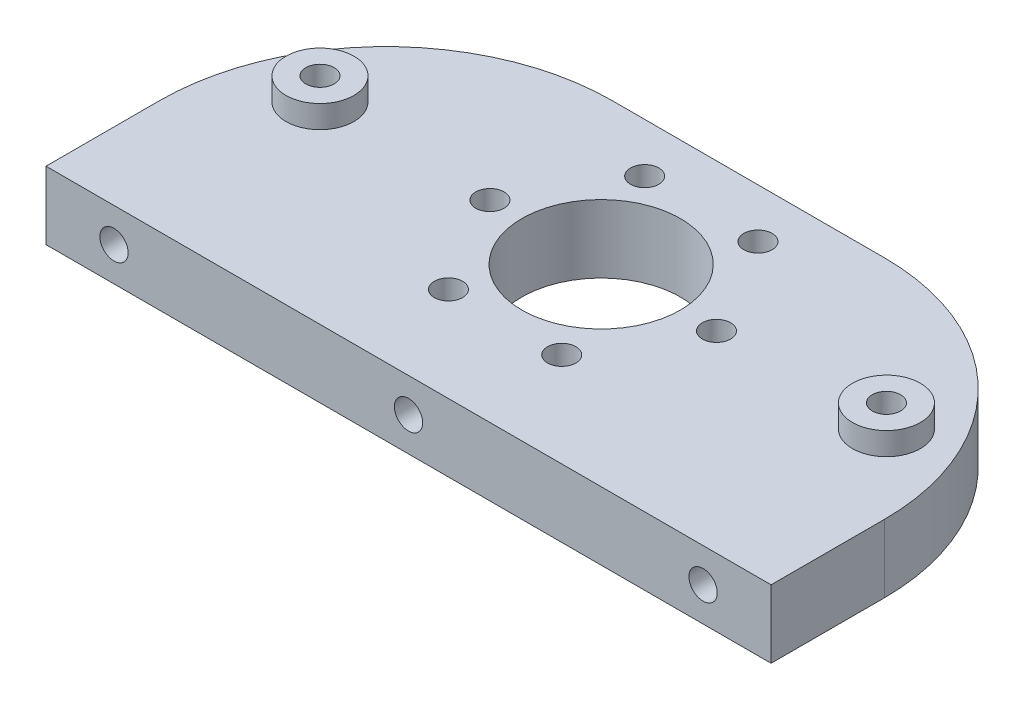
ISO-10303-21;
HEADER;
FILE_DESCRIPTION(('STEP AP214'),'2;1');
FILE_NAME('part.step','',(''),(''),'','','');
FILE_SCHEMA(('AUTOMOTIVE_DESIGN { 1 0 10303 214 1 1 1 1 }'));
ENDSEC;
DATA;
#1=APPLICATION_CONTEXT('core data for automotive mechanical design processes');
#2=APPLICATION_PROTOCOL_DEFINITION('international standard','automotive_design',2000,#1);
#3=PRODUCT_CONTEXT('',#1,'mechanical');
#4=PRODUCT('Part','Part','',(#3));
#5=PRODUCT_RELATED_PRODUCT_CATEGORY('part','',(#4));
#6=PRODUCT_DEFINITION_FORMATION('','',#4);
#7=PRODUCT_DEFINITION_CONTEXT('part definition',#1,'design');
#8=PRODUCT_DEFINITION('design','',#6,#7);
#9=PRODUCT_DEFINITION_SHAPE('','',#8);
#10=(LENGTH_UNIT() NAMED_UNIT(*) SI_UNIT(.MILLI.,.METRE.));
#11=(NAMED_UNIT(*) PLANE_ANGLE_UNIT() SI_UNIT($,.RADIAN.));
#12=(NAMED_UNIT(*) SI_UNIT($,.STERADIAN.) SOLID_ANGLE_UNIT());
#13=UNCERTAINTY_MEASURE_WITH_UNIT(LENGTH_MEASURE(1.E-05),#10,'distance_accuracy_value','');
#14=(GEOMETRIC_REPRESENTATION_CONTEXT(3) GLOBAL_UNCERTAINTY_ASSIGNED_CONTEXT((#13)) GLOBAL_UNIT_ASSIGNED_CONTEXT((#10,
#11,#12)) REPRESENTATION_CONTEXT('',''));
#15=CARTESIAN_POINT('',(0.,0.,0.));
#16=DIRECTION('',(0.,0.,1.));
#17=DIRECTION('',(1.,0.,0.));
#18=AXIS2_PLACEMENT_3D('',#15,#16,#17);
#19=CARTESIAN_POINT('',(-53.365810967445,3.,7.67533084864312));
#20=DIRECTION('',(1.,0.,0.));
#21=DIRECTION('',(0.,0.,-1.));
#22=AXIS2_PLACEMENT_3D('',#19,#20,#21);
#23=PLANE('',#22);
#24=DIRECTION('',(0.,0.,1.));
#25=VECTOR('',#24,1.);
#26=CARTESIAN_POINT('',(-53.365810967445,3.,7.67533084864312));
#27=LINE('',#26,#25);
#28=CARTESIAN_POINT('',(-53.365810967445,3.,17.6753308486431));
#29=VERTEX_POINT('',#28);
#30=CARTESIAN_POINT('',(-53.365810967445,3.,22.6753308486431));
#31=VERTEX_POINT('',#30);
#32=EDGE_CURVE('E239',#29,#31,#27,.T.);
#33=ORIENTED_EDGE('',*,*,#32,.F.);
#34=DIRECTION('',(0.,-1.,0.));
#35=VECTOR('',#34,1.);
#36=CARTESIAN_POINT('',(-53.365810967445,3.,17.6753308486431));
#37=LINE('',#36,#35);
#38=CARTESIAN_POINT('',(-53.365810967445,0.,17.6753308486431));
#39=VERTEX_POINT('',#38);
#40=EDGE_CURVE('E11',#29,#39,#37,.T.);
#41=ORIENTED_EDGE('',*,*,#40,.T.);
#42=DIRECTION('',(0.,0.,1.));
#43=VECTOR('',#42,1.);
#44=CARTESIAN_POINT('',(-53.365810967445,0.,7.67533084864312));
#45=LINE('',#44,#43);
#46=CARTESIAN_POINT('',(-53.365810967445,0.,22.6753308486431));
#47=VERTEX_POINT('',#46);
#48=EDGE_CURVE('E253',#39,#47,#45,.T.);
#49=ORIENTED_EDGE('',*,*,#48,.T.);
#50=DIRECTION('',(0.,-1.,0.));
#51=VECTOR('',#50,1.);
#52=CARTESIAN_POINT('',(-53.365810967445,3.,22.6753308486431));
#53=LINE('',#52,#51);
#54=EDGE_CURVE('E268',#31,#47,#53,.T.);
#55=ORIENTED_EDGE('',*,*,#54,.F.);
#56=EDGE_LOOP('',(#33,#41,#49,#55));
#57=FACE_BOUND('',#56,.T.);
#58=ADVANCED_FACE('F55',(#57),#23,.F.);
#59=CARTESIAN_POINT('',(-53.365810967445,3.,22.6753308486431));
#60=DIRECTION('',(0.,0.,-1.));
#61=DIRECTION('',(-1.,0.,0.));
#62=AXIS2_PLACEMENT_3D('',#59,#60,#61);
#63=PLANE('',#62);
#64=CARTESIAN_POINT('',(-50.365810967445,1.5,22.6753308486431));
#65=DIRECTION('',(0.,0.,1.));
#66=DIRECTION('',(1.,0.,0.));
#67=AXIS2_PLACEMENT_3D('',#64,#65,#66);
#68=CIRCLE('',#67,0.624999999999987);
#69=CARTESIAN_POINT('',(-49.740810967445,1.5,22.6753308486431));
#70=VERTEX_POINT('',#69);
#71=EDGE_CURVE('E131',#70,#70,#68,.T.);
#72=ORIENTED_EDGE('',*,*,#71,.F.);
#73=EDGE_LOOP('',(#72));
#74=FACE_BOUND('',#73,.T.);
#75=CARTESIAN_POINT('',(-24.365810967445,1.5,22.6753308486431));
#76=DIRECTION('',(0.,0.,1.));
#77=DIRECTION('',(1.,0.,0.));
#78=AXIS2_PLACEMENT_3D('',#75,#76,#77);
#79=CIRCLE('',#78,0.62499999999999);
#80=CARTESIAN_POINT('',(-23.740810967445,1.5,22.6753308486431));
#81=VERTEX_POINT('',#80);
#82=EDGE_CURVE('E130',#81,#81,#79,.T.);
#83=ORIENTED_EDGE('',*,*,#82,.F.);
#84=EDGE_LOOP('',(#83));
#85=FACE_BOUND('',#84,.T.);
#86=CARTESIAN_POINT('',(-37.365810967445,1.5,22.6753308486431));
#87=DIRECTION('',(0.,0.,1.));
#88=DIRECTION('',(1.,0.,0.));
#89=AXIS2_PLACEMENT_3D('',#86,#87,#88);
#90=CIRCLE('',#89,0.624999999999987);
#91=CARTESIAN_POINT('',(-36.740810967445,1.5,22.6753308486431));
#92=VERTEX_POINT('',#91);
#93=EDGE_CURVE('E146',#92,#92,#90,.T.);
#94=ORIENTED_EDGE('',*,*,#93,.F.);
#95=EDGE_LOOP('',(#94));
#96=FACE_BOUND('',#95,.T.);
#97=DIRECTION('',(1.,0.,0.));
#98=VECTOR('',#97,1.);
#99=CARTESIAN_POINT('',(-53.365810967445,0.,22.6753308486431));
#100=LINE('',#99,#98);
#101=CARTESIAN_POINT('',(-21.365810967445,0.,22.6753308486431));
#102=VERTEX_POINT('',#101);
#103=EDGE_CURVE('E256',#47,#102,#100,.T.);
#104=ORIENTED_EDGE('',*,*,#103,.T.);
#105=DIRECTION('',(0.,-1.,0.));
#106=VECTOR('',#105,1.);
#107=CARTESIAN_POINT('',(-21.365810967445,3.,22.6753308486431));
#108=LINE('',#107,#106);
#109=CARTESIAN_POINT('',(-21.365810967445,3.,22.6753308486431));
#110=VERTEX_POINT('',#109);
#111=EDGE_CURVE('E252',#110,#102,#108,.T.);
#112=ORIENTED_EDGE('',*,*,#111,.F.);
#113=DIRECTION('',(1.,0.,0.));
#114=VECTOR('',#113,1.);
#115=CARTESIAN_POINT('',(-53.365810967445,3.,22.6753308486431));
#116=LINE('',#115,#114);
#117=EDGE_CURVE('E242',#31,#110,#116,.T.);
#118=ORIENTED_EDGE('',*,*,#117,.F.);
#119=ORIENTED_EDGE('',*,*,#54,.T.);
#120=EDGE_LOOP('',(#104,#112,#118,#119));
#121=FACE_BOUND('',#120,.T.);
#122=ADVANCED_FACE('F312',(#74,#85,#96,#121),#63,.F.);
#123=CARTESIAN_POINT('',(-21.365810967445,3.,7.67533084864312));
#124=DIRECTION('',(-1.,0.,0.));
#125=DIRECTION('',(0.,0.,1.));
#126=AXIS2_PLACEMENT_3D('',#123,#124,#125);
#127=PLANE('',#126);
#128=DIRECTION('',(0.,0.,-1.));
#129=VECTOR('',#128,1.);
#130=CARTESIAN_POINT('',(-21.365810967445,0.,7.67533084864312));
#131=LINE('',#130,#129);
#132=CARTESIAN_POINT('',(-21.365810967445,0.,17.6753308486431));
#133=VERTEX_POINT('',#132);
#134=EDGE_CURVE('E259',#102,#133,#131,.T.);
#135=ORIENTED_EDGE('',*,*,#134,.T.);
#136=DIRECTION('',(0.,-1.,0.));
#137=VECTOR('',#136,1.);
#138=CARTESIAN_POINT('',(-21.365810967445,3.,17.6753308486431));
#139=LINE('',#138,#137);
#140=CARTESIAN_POINT('',(-21.365810967445,3.,17.6753308486431));
#141=VERTEX_POINT('',#140);
#142=EDGE_CURVE('E79',#133,#141,#139,.F.);
#143=ORIENTED_EDGE('',*,*,#142,.T.);
#144=DIRECTION('',(0.,0.,-1.));
#145=VECTOR('',#144,1.);
#146=CARTESIAN_POINT('',(-21.365810967445,3.,7.67533084864312));
#147=LINE('',#146,#145);
#148=EDGE_CURVE('E246',#110,#141,#147,.T.);
#149=ORIENTED_EDGE('',*,*,#148,.F.);
#150=ORIENTED_EDGE('',*,*,#111,.T.);
#151=EDGE_LOOP('',(#135,#143,#149,#150));
#152=FACE_BOUND('',#151,.T.);
#153=ADVANCED_FACE('F308',(#152),#127,.F.);
#154=CARTESIAN_POINT('',(-53.365810967445,3.,7.67533084864312));
#155=DIRECTION('',(0.,0.,1.));
#156=DIRECTION('',(1.,0.,0.));
#157=AXIS2_PLACEMENT_3D('',#154,#155,#156);
#158=PLANE('',#157);
#159=DIRECTION('',(-1.,0.,0.));
#160=VECTOR('',#159,1.);
#161=CARTESIAN_POINT('',(-53.365810967445,3.,7.67533084864312));
#162=LINE('',#161,#160);
#163=CARTESIAN_POINT('',(-31.365810967445,3.,7.67533084864312));
#164=VERTEX_POINT('',#163);
#165=CARTESIAN_POINT('',(-43.365810967445,3.,7.67533084864312));
#166=VERTEX_POINT('',#165);
#167=EDGE_CURVE('E249',#164,#166,#162,.T.);
#168=ORIENTED_EDGE('',*,*,#167,.F.);
#169=DIRECTION('',(0.,-1.,0.));
#170=VECTOR('',#169,1.);
#171=CARTESIAN_POINT('',(-31.365810967445,3.,7.67533084864312));
#172=LINE('',#171,#170);
#173=CARTESIAN_POINT('',(-31.365810967445,0.,7.67533084864312));
#174=VERTEX_POINT('',#173);
#175=EDGE_CURVE('E278',#164,#174,#172,.T.);
#176=ORIENTED_EDGE('',*,*,#175,.T.);
#177=DIRECTION('',(-1.,0.,0.));
#178=VECTOR('',#177,1.);
#179=CARTESIAN_POINT('',(-53.365810967445,0.,7.67533084864312));
#180=LINE('',#179,#178);
#181=CARTESIAN_POINT('',(-43.365810967445,0.,7.67533084864312));
#182=VERTEX_POINT('',#181);
#183=EDGE_CURVE('E243',#174,#182,#180,.T.);
#184=ORIENTED_EDGE('',*,*,#183,.T.);
#185=DIRECTION('',(0.,-1.,0.));
#186=VECTOR('',#185,1.);
#187=CARTESIAN_POINT('',(-43.365810967445,3.,7.67533084864312));
#188=LINE('',#187,#186);
#189=EDGE_CURVE('E272',#182,#166,#188,.F.);
#190=ORIENTED_EDGE('',*,*,#189,.T.);
#191=EDGE_LOOP('',(#168,#176,#184,#190));
#192=FACE_BOUND('',#191,.T.);
#193=ADVANCED_FACE('F300',(#192),#158,.F.);
#194=CARTESIAN_POINT('',(0.,3.,0.));
#195=DIRECTION('',(0.,1.,0.));
#196=DIRECTION('',(0.,0.,1.));
#197=AXIS2_PLACEMENT_3D('',#194,#195,#196);
#198=PLANE('',#197);
#199=CARTESIAN_POINT('',(-49.7744643105847,3.,14.1753308486431));
#200=DIRECTION('',(0.,1.,0.));
#201=DIRECTION('',(0.,0.,1.));
#202=AXIS2_PLACEMENT_3D('',#199,#200,#201);
#203=CIRCLE('',#202,1.5);
#204=CARTESIAN_POINT('',(-49.7744643105847,3.,15.6753308486431));
#205=VERTEX_POINT('',#204);
#206=EDGE_CURVE('E176',#205,#205,#203,.T.);
#207=ORIENTED_EDGE('',*,*,#206,.F.);
#208=EDGE_LOOP('',(#207));
#209=FACE_BOUND('',#208,.T.);
#210=CARTESIAN_POINT('',(-24.7744643105847,3.,14.1753308486431));
#211=DIRECTION('',(0.,1.,0.));
#212=DIRECTION('',(0.,0.,1.));
#213=AXIS2_PLACEMENT_3D('',#210,#211,#212);
#214=CIRCLE('',#213,1.5);
#215=CARTESIAN_POINT('',(-24.7744643105847,3.,15.6753308486431));
#216=VERTEX_POINT('',#215);
#217=EDGE_CURVE('E180',#216,#216,#214,.T.);
#218=ORIENTED_EDGE('',*,*,#217,.F.);
#219=EDGE_LOOP('',(#218));
#220=FACE_BOUND('',#219,.T.);
#221=CARTESIAN_POINT('',(-34.7744643105847,3.,18.5054578675653));
#222=DIRECTION('',(0.,1.,0.));
#223=DIRECTION('',(0.,0.,1.));
#224=AXIS2_PLACEMENT_3D('',#221,#222,#223);
#225=CIRCLE('',#224,0.624999999999987);
#226=CARTESIAN_POINT('',(-34.7744643105847,3.,19.1304578675653));
#227=VERTEX_POINT('',#226);
#228=EDGE_CURVE('E175',#227,#227,#225,.T.);
#229=ORIENTED_EDGE('',*,*,#228,.F.);
#230=EDGE_LOOP('',(#229));
#231=FACE_BOUND('',#230,.T.);
#232=CARTESIAN_POINT('',(-39.7744643105848,3.,18.5054578675653));
#233=DIRECTION('',(0.,1.,0.));
#234=DIRECTION('',(0.,0.,1.));
#235=AXIS2_PLACEMENT_3D('',#232,#233,#234);
#236=CIRCLE('',#235,0.624999999999987);
#237=CARTESIAN_POINT('',(-39.7744643105848,3.,19.1304578675653));
#238=VERTEX_POINT('',#237);
#239=EDGE_CURVE('E194',#238,#238,#236,.T.);
#240=ORIENTED_EDGE('',*,*,#239,.F.);
#241=EDGE_LOOP('',(#240));
#242=FACE_BOUND('',#241,.T.);
#243=CARTESIAN_POINT('',(-42.2744643105847,3.,14.1753308486431));
#244=DIRECTION('',(0.,1.,0.));
#245=DIRECTION('',(0.,0.,1.));
#246=AXIS2_PLACEMENT_3D('',#243,#244,#245);
#247=CIRCLE('',#246,0.624999999999987);
#248=CARTESIAN_POINT('',(-42.2744643105847,3.,14.8003308486431));
#249=VERTEX_POINT('',#248);
#250=EDGE_CURVE('E202',#249,#249,#247,.T.);
#251=ORIENTED_EDGE('',*,*,#250,.F.);
#252=EDGE_LOOP('',(#251));
#253=FACE_BOUND('',#252,.T.);
#254=CARTESIAN_POINT('',(-39.7744643105848,3.,9.84520382972094));
#255=DIRECTION('',(0.,1.,0.));
#256=DIRECTION('',(0.,0.,1.));
#257=AXIS2_PLACEMENT_3D('',#254,#255,#256);
#258=CIRCLE('',#257,0.624999999999987);
#259=CARTESIAN_POINT('',(-39.7744643105848,3.,10.4702038297209));
#260=VERTEX_POINT('',#259);
#261=EDGE_CURVE('E210',#260,#260,#258,.T.);
#262=ORIENTED_EDGE('',*,*,#261,.F.);
#263=EDGE_LOOP('',(#262));
#264=FACE_BOUND('',#263,.T.);
#265=CARTESIAN_POINT('',(-34.7744643105847,3.,9.84520382972094));
#266=DIRECTION('',(0.,1.,0.));
#267=DIRECTION('',(0.,0.,1.));
#268=AXIS2_PLACEMENT_3D('',#265,#266,#267);
#269=CIRCLE('',#268,0.624999999999987);
#270=CARTESIAN_POINT('',(-34.7744643105847,3.,10.4702038297209));
#271=VERTEX_POINT('',#270);
#272=EDGE_CURVE('E218',#271,#271,#269,.T.);
#273=ORIENTED_EDGE('',*,*,#272,.F.);
#274=EDGE_LOOP('',(#273));
#275=FACE_BOUND('',#274,.T.);
#276=CARTESIAN_POINT('',(-32.2744643105847,3.,14.1753308486432));
#277=DIRECTION('',(0.,1.,0.));
#278=DIRECTION('',(0.,0.,1.));
#279=AXIS2_PLACEMENT_3D('',#276,#277,#278);
#280=CIRCLE('',#279,0.624999999999987);
#281=CARTESIAN_POINT('',(-32.2744643105847,3.,14.8003308486431));
#282=VERTEX_POINT('',#281);
#283=EDGE_CURVE('E226',#282,#282,#280,.T.);
#284=ORIENTED_EDGE('',*,*,#283,.F.);
#285=EDGE_LOOP('',(#284));
#286=FACE_BOUND('',#285,.T.);
#287=CARTESIAN_POINT('',(-37.365810967445,3.,14.1753308486431));
#288=DIRECTION('',(0.,1.,0.));
#289=DIRECTION('',(0.,0.,1.));
#290=AXIS2_PLACEMENT_3D('',#287,#288,#289);
#291=CIRCLE('',#290,3.5);
#292=CARTESIAN_POINT('',(-37.365810967445,3.,17.6753308486431));
#293=VERTEX_POINT('',#292);
#294=EDGE_CURVE('E234',#293,#293,#291,.T.);
#295=ORIENTED_EDGE('',*,*,#294,.F.);
#296=EDGE_LOOP('',(#295));
#297=FACE_BOUND('',#296,.T.);
#298=ORIENTED_EDGE('',*,*,#148,.T.);
#299=CARTESIAN_POINT('',(-31.365810967445,3.,17.6753308486431));
#300=DIRECTION('',(0.,1.,0.));
#301=DIRECTION('',(0.,0.,1.));
#302=AXIS2_PLACEMENT_3D('',#299,#300,#301);
#303=CIRCLE('',#302,10.);
#304=EDGE_CURVE('E64',#141,#164,#303,.T.);
#305=ORIENTED_EDGE('',*,*,#304,.T.);
#306=ORIENTED_EDGE('',*,*,#167,.T.);
#307=CARTESIAN_POINT('',(-43.365810967445,3.,17.6753308486431));
#308=DIRECTION('',(0.,1.,0.));
#309=DIRECTION('',(0.,0.,1.));
#310=AXIS2_PLACEMENT_3D('',#307,#308,#309);
#311=CIRCLE('',#310,10.);
#312=EDGE_CURVE('E71',#166,#29,#311,.T.);
#313=ORIENTED_EDGE('',*,*,#312,.T.);
#314=ORIENTED_EDGE('',*,*,#32,.T.);
#315=ORIENTED_EDGE('',*,*,#117,.T.);
#316=EDGE_LOOP('',(#298,#305,#306,#313,#314,#315));
#317=FACE_BOUND('',#316,.T.);
#318=ADVANCED_FACE('F296',(#209,#220,#231,#242,#253,#264,#275,#286,#297,#317),#198,.T.);
#319=CARTESIAN_POINT('',(0.,0.,0.));
#320=DIRECTION('',(0.,1.,0.));
#321=DIRECTION('',(0.,0.,1.));
#322=AXIS2_PLACEMENT_3D('',#319,#320,#321);
#323=PLANE('',#322);
#324=CARTESIAN_POINT('',(-49.7744643105847,0.,14.1753308486431));
#325=DIRECTION('',(0.,1.,0.));
#326=DIRECTION('',(0.,0.,1.));
#327=AXIS2_PLACEMENT_3D('',#324,#325,#326);
#328=CIRCLE('',#327,0.625000000000001);
#329=CARTESIAN_POINT('',(-49.7744643105847,0.,14.8003308486431));
#330=VERTEX_POINT('',#329);
#331=EDGE_CURVE('E158',#330,#330,#328,.T.);
#332=ORIENTED_EDGE('',*,*,#331,.T.);
#333=EDGE_LOOP('',(#332));
#334=FACE_BOUND('',#333,.T.);
#335=CARTESIAN_POINT('',(-24.7744643105847,0.,14.1753308486431));
#336=DIRECTION('',(0.,1.,0.));
#337=DIRECTION('',(0.,0.,1.));
#338=AXIS2_PLACEMENT_3D('',#335,#336,#337);
#339=CIRCLE('',#338,0.625000000000001);
#340=CARTESIAN_POINT('',(-24.7744643105847,0.,14.8003308486431));
#341=VERTEX_POINT('',#340);
#342=EDGE_CURVE('E166',#341,#341,#339,.T.);
#343=ORIENTED_EDGE('',*,*,#342,.T.);
#344=EDGE_LOOP('',(#343));
#345=FACE_BOUND('',#344,.T.);
#346=CARTESIAN_POINT('',(-34.7744643105847,0.,18.5054578675653));
#347=DIRECTION('',(0.,1.,0.));
#348=DIRECTION('',(0.,0.,1.));
#349=AXIS2_PLACEMENT_3D('',#346,#347,#348);
#350=CIRCLE('',#349,0.625000000000001);
#351=CARTESIAN_POINT('',(-34.7744643105847,0.,19.1304578675653));
#352=VERTEX_POINT('',#351);
#353=EDGE_CURVE('E190',#352,#352,#350,.T.);
#354=ORIENTED_EDGE('',*,*,#353,.T.);
#355=EDGE_LOOP('',(#354));
#356=FACE_BOUND('',#355,.T.);
#357=CARTESIAN_POINT('',(-39.7744643105848,0.,18.5054578675653));
#358=DIRECTION('',(0.,1.,0.));
#359=DIRECTION('',(0.,0.,1.));
#360=AXIS2_PLACEMENT_3D('',#357,#358,#359);
#361=CIRCLE('',#360,0.625000000000001);
#362=CARTESIAN_POINT('',(-39.7744643105848,0.,19.1304578675653));
#363=VERTEX_POINT('',#362);
#364=EDGE_CURVE('E198',#363,#363,#361,.T.);
#365=ORIENTED_EDGE('',*,*,#364,.T.);
#366=EDGE_LOOP('',(#365));
#367=FACE_BOUND('',#366,.T.);
#368=CARTESIAN_POINT('',(-42.2744643105847,0.,14.1753308486431));
#369=DIRECTION('',(0.,1.,0.));
#370=DIRECTION('',(0.,0.,1.));
#371=AXIS2_PLACEMENT_3D('',#368,#369,#370);
#372=CIRCLE('',#371,0.625000000000001);
#373=CARTESIAN_POINT('',(-42.2744643105847,0.,14.8003308486431));
#374=VERTEX_POINT('',#373);
#375=EDGE_CURVE('E206',#374,#374,#372,.T.);
#376=ORIENTED_EDGE('',*,*,#375,.T.);
#377=EDGE_LOOP('',(#376));
#378=FACE_BOUND('',#377,.T.);
#379=CARTESIAN_POINT('',(-39.7744643105848,0.,9.84520382972094));
#380=DIRECTION('',(0.,1.,0.));
#381=DIRECTION('',(0.,0.,1.));
#382=AXIS2_PLACEMENT_3D('',#379,#380,#381);
#383=CIRCLE('',#382,0.625000000000001);
#384=CARTESIAN_POINT('',(-39.7744643105848,0.,10.4702038297209));
#385=VERTEX_POINT('',#384);
#386=EDGE_CURVE('E214',#385,#385,#383,.T.);
#387=ORIENTED_EDGE('',*,*,#386,.T.);
#388=EDGE_LOOP('',(#387));
#389=FACE_BOUND('',#388,.T.);
#390=CARTESIAN_POINT('',(-34.7744643105847,0.,9.84520382972094));
#391=DIRECTION('',(0.,1.,0.));
#392=DIRECTION('',(0.,0.,1.));
#393=AXIS2_PLACEMENT_3D('',#390,#391,#392);
#394=CIRCLE('',#393,0.625000000000001);
#395=CARTESIAN_POINT('',(-34.7744643105847,0.,10.4702038297209));
#396=VERTEX_POINT('',#395);
#397=EDGE_CURVE('E222',#396,#396,#394,.T.);
#398=ORIENTED_EDGE('',*,*,#397,.T.);
#399=EDGE_LOOP('',(#398));
#400=FACE_BOUND('',#399,.T.);
#401=CARTESIAN_POINT('',(-32.2744643105847,0.,14.1753308486432));
#402=DIRECTION('',(0.,1.,0.));
#403=DIRECTION('',(0.,0.,1.));
#404=AXIS2_PLACEMENT_3D('',#401,#402,#403);
#405=CIRCLE('',#404,0.625000000000001);
#406=CARTESIAN_POINT('',(-32.2744643105847,0.,14.8003308486432));
#407=VERTEX_POINT('',#406);
#408=EDGE_CURVE('E230',#407,#407,#405,.T.);
#409=ORIENTED_EDGE('',*,*,#408,.T.);
#410=EDGE_LOOP('',(#409));
#411=FACE_BOUND('',#410,.T.);
#412=CARTESIAN_POINT('',(-37.365810967445,0.,14.1753308486431));
#413=DIRECTION('',(0.,1.,0.));
#414=DIRECTION('',(0.,0.,1.));
#415=AXIS2_PLACEMENT_3D('',#412,#413,#414);
#416=CIRCLE('',#415,3.5);
#417=CARTESIAN_POINT('',(-37.365810967445,0.,17.6753308486431));
#418=VERTEX_POINT('',#417);
#419=EDGE_CURVE('E238',#418,#418,#416,.T.);
#420=ORIENTED_EDGE('',*,*,#419,.T.);
#421=EDGE_LOOP('',(#420));
#422=FACE_BOUND('',#421,.T.);
#423=ORIENTED_EDGE('',*,*,#183,.F.);
#424=CARTESIAN_POINT('',(-31.365810967445,0.,17.6753308486431));
#425=DIRECTION('',(0.,1.,0.));
#426=DIRECTION('',(0.,0.,1.));
#427=AXIS2_PLACEMENT_3D('',#424,#425,#426);
#428=CIRCLE('',#427,10.);
#429=EDGE_CURVE('E285',#174,#133,#428,.F.);
#430=ORIENTED_EDGE('',*,*,#429,.T.);
#431=ORIENTED_EDGE('',*,*,#134,.F.);
#432=ORIENTED_EDGE('',*,*,#103,.F.);
#433=ORIENTED_EDGE('',*,*,#48,.F.);
#434=CARTESIAN_POINT('',(-43.365810967445,0.,17.6753308486431));
#435=DIRECTION('',(0.,1.,0.));
#436=DIRECTION('',(0.,0.,1.));
#437=AXIS2_PLACEMENT_3D('',#434,#435,#436);
#438=CIRCLE('',#437,10.);
#439=EDGE_CURVE('E282',#39,#182,#438,.F.);
#440=ORIENTED_EDGE('',*,*,#439,.T.);
#441=EDGE_LOOP('',(#423,#430,#431,#432,#433,#440));
#442=FACE_BOUND('',#441,.T.);
#443=ADVANCED_FACE('F306',(#334,#345,#356,#367,#378,#389,#400,#411,#422,#442),#323,.F.);
#444=CARTESIAN_POINT('',(-37.365810967445,-1.,14.1753308486431));
#445=DIRECTION('',(0.,1.,0.));
#446=DIRECTION('',(0.,0.,1.));
#447=AXIS2_PLACEMENT_3D('',#444,#445,#446);
#448=CYLINDRICAL_SURFACE('',#447,3.5);
#449=ORIENTED_EDGE('',*,*,#294,.T.);
#450=EDGE_LOOP('',(#449));
#451=FACE_BOUND('',#450,.T.);
#452=ORIENTED_EDGE('',*,*,#419,.F.);
#453=EDGE_LOOP('',(#452));
#454=FACE_BOUND('',#453,.T.);
#455=ADVANCED_FACE('F340',(#451,#454),#448,.F.);
#456=CARTESIAN_POINT('',(-32.2744643105847,3.,14.1753308486432));
#457=DIRECTION('',(0.,1.,0.));
#458=DIRECTION('',(0.,0.,1.));
#459=AXIS2_PLACEMENT_3D('',#456,#457,#458);
#460=CYLINDRICAL_SURFACE('',#459,0.624999999999994);
#461=ORIENTED_EDGE('',*,*,#408,.F.);
#462=EDGE_LOOP('',(#461));
#463=FACE_BOUND('',#462,.T.);
#464=ORIENTED_EDGE('',*,*,#283,.T.);
#465=EDGE_LOOP('',(#464));
#466=FACE_BOUND('',#465,.T.);
#467=ADVANCED_FACE('F347',(#463,#466),#460,.F.);
#468=CARTESIAN_POINT('',(-34.7744643105847,3.,9.84520382972094));
#469=DIRECTION('',(0.,1.,0.));
#470=DIRECTION('',(0.,0.,1.));
#471=AXIS2_PLACEMENT_3D('',#468,#469,#470);
#472=CYLINDRICAL_SURFACE('',#471,0.624999999999994);
#473=ORIENTED_EDGE('',*,*,#397,.F.);
#474=EDGE_LOOP('',(#473));
#475=FACE_BOUND('',#474,.T.);
#476=ORIENTED_EDGE('',*,*,#272,.T.);
#477=EDGE_LOOP('',(#476));
#478=FACE_BOUND('',#477,.T.);
#479=ADVANCED_FACE('F351',(#475,#478),#472,.F.);
#480=CARTESIAN_POINT('',(-39.7744643105848,3.,9.84520382972094));
#481=DIRECTION('',(0.,1.,0.));
#482=DIRECTION('',(0.,0.,1.));
#483=AXIS2_PLACEMENT_3D('',#480,#481,#482);
#484=CYLINDRICAL_SURFACE('',#483,0.624999999999994);
#485=ORIENTED_EDGE('',*,*,#386,.F.);
#486=EDGE_LOOP('',(#485));
#487=FACE_BOUND('',#486,.T.);
#488=ORIENTED_EDGE('',*,*,#261,.T.);
#489=EDGE_LOOP('',(#488));
#490=FACE_BOUND('',#489,.T.);
#491=ADVANCED_FACE('F355',(#487,#490),#484,.F.);
#492=CARTESIAN_POINT('',(-42.2744643105847,3.,14.1753308486431));
#493=DIRECTION('',(0.,1.,0.));
#494=DIRECTION('',(0.,0.,1.));
#495=AXIS2_PLACEMENT_3D('',#492,#493,#494);
#496=CYLINDRICAL_SURFACE('',#495,0.624999999999994);
#497=ORIENTED_EDGE('',*,*,#375,.F.);
#498=EDGE_LOOP('',(#497));
#499=FACE_BOUND('',#498,.T.);
#500=ORIENTED_EDGE('',*,*,#250,.T.);
#501=EDGE_LOOP('',(#500));
#502=FACE_BOUND('',#501,.T.);
#503=ADVANCED_FACE('F359',(#499,#502),#496,.F.);
#504=CARTESIAN_POINT('',(-39.7744643105848,3.,18.5054578675653));
#505=DIRECTION('',(0.,1.,0.));
#506=DIRECTION('',(0.,0.,1.));
#507=AXIS2_PLACEMENT_3D('',#504,#505,#506);
#508=CYLINDRICAL_SURFACE('',#507,0.624999999999994);
#509=ORIENTED_EDGE('',*,*,#364,.F.);
#510=EDGE_LOOP('',(#509));
#511=FACE_BOUND('',#510,.T.);
#512=ORIENTED_EDGE('',*,*,#239,.T.);
#513=EDGE_LOOP('',(#512));
#514=FACE_BOUND('',#513,.T.);
#515=ADVANCED_FACE('F363',(#511,#514),#508,.F.);
#516=CARTESIAN_POINT('',(-34.7744643105847,3.,18.5054578675653));
#517=DIRECTION('',(0.,1.,0.));
#518=DIRECTION('',(0.,0.,1.));
#519=AXIS2_PLACEMENT_3D('',#516,#517,#518);
#520=CYLINDRICAL_SURFACE('',#519,0.624999999999994);
#521=ORIENTED_EDGE('',*,*,#353,.F.);
#522=EDGE_LOOP('',(#521));
#523=FACE_BOUND('',#522,.T.);
#524=ORIENTED_EDGE('',*,*,#228,.T.);
#525=EDGE_LOOP('',(#524));
#526=FACE_BOUND('',#525,.T.);
#527=ADVANCED_FACE('F367',(#523,#526),#520,.F.);
#528=CARTESIAN_POINT('',(-24.7744643105847,4.,14.1753308486431));
#529=DIRECTION('',(0.,-1.,0.));
#530=DIRECTION('',(0.,0.,-1.));
#531=AXIS2_PLACEMENT_3D('',#528,#529,#530);
#532=CYLINDRICAL_SURFACE('',#531,1.5);
#533=CARTESIAN_POINT('',(-24.7744643105847,4.,14.1753308486431));
#534=DIRECTION('',(0.,1.,0.));
#535=DIRECTION('',(0.,0.,1.));
#536=AXIS2_PLACEMENT_3D('',#533,#534,#535);
#537=CIRCLE('',#536,1.5);
#538=CARTESIAN_POINT('',(-24.7744643105847,4.,15.6753308486431));
#539=VERTEX_POINT('',#538);
#540=EDGE_CURVE('E170',#539,#539,#537,.T.);
#541=ORIENTED_EDGE('',*,*,#540,.F.);
#542=EDGE_LOOP('',(#541));
#543=FACE_BOUND('',#542,.T.);
#544=ORIENTED_EDGE('',*,*,#217,.T.);
#545=EDGE_LOOP('',(#544));
#546=FACE_BOUND('',#545,.T.);
#547=ADVANCED_FACE('F371',(#543,#546),#532,.T.);
#548=CARTESIAN_POINT('',(-24.7744643105847,4.,14.1753308486431));
#549=DIRECTION('',(0.,1.,0.));
#550=DIRECTION('',(0.,0.,1.));
#551=AXIS2_PLACEMENT_3D('',#548,#549,#550);
#552=PLANE('',#551);
#553=CARTESIAN_POINT('',(-24.7744643105847,4.,14.1753308486431));
#554=DIRECTION('',(0.,1.,0.));
#555=DIRECTION('',(0.,0.,1.));
#556=AXIS2_PLACEMENT_3D('',#553,#554,#555);
#557=CIRCLE('',#556,0.624999999999987);
#558=CARTESIAN_POINT('',(-24.7744643105847,4.,14.8003308486431));
#559=VERTEX_POINT('',#558);
#560=EDGE_CURVE('E162',#559,#559,#557,.T.);
#561=ORIENTED_EDGE('',*,*,#560,.F.);
#562=EDGE_LOOP('',(#561));
#563=FACE_BOUND('',#562,.T.);
#564=ORIENTED_EDGE('',*,*,#540,.T.);
#565=EDGE_LOOP('',(#564));
#566=FACE_BOUND('',#565,.T.);
#567=ADVANCED_FACE('F373',(#563,#566),#552,.T.);
#568=CARTESIAN_POINT('',(-49.7744643105847,4.,14.1753308486431));
#569=DIRECTION('',(0.,-1.,0.));
#570=DIRECTION('',(0.,0.,-1.));
#571=AXIS2_PLACEMENT_3D('',#568,#569,#570);
#572=CYLINDRICAL_SURFACE('',#571,1.5);
#573=CARTESIAN_POINT('',(-49.7744643105847,4.,14.1753308486431));
#574=DIRECTION('',(0.,1.,0.));
#575=DIRECTION('',(0.,0.,1.));
#576=AXIS2_PLACEMENT_3D('',#573,#574,#575);
#577=CIRCLE('',#576,1.5);
#578=CARTESIAN_POINT('',(-49.7744643105847,4.,15.6753308486431));
#579=VERTEX_POINT('',#578);
#580=EDGE_CURVE('E171',#579,#579,#577,.T.);
#581=ORIENTED_EDGE('',*,*,#580,.F.);
#582=EDGE_LOOP('',(#581));
#583=FACE_BOUND('',#582,.T.);
#584=ORIENTED_EDGE('',*,*,#206,.T.);
#585=EDGE_LOOP('',(#584));
#586=FACE_BOUND('',#585,.T.);
#587=ADVANCED_FACE('F376',(#583,#586),#572,.T.);
#588=CARTESIAN_POINT('',(-49.7744643105847,4.,14.1753308486431));
#589=DIRECTION('',(0.,1.,0.));
#590=DIRECTION('',(0.,0.,1.));
#591=AXIS2_PLACEMENT_3D('',#588,#589,#590);
#592=PLANE('',#591);
#593=CARTESIAN_POINT('',(-49.7744643105847,4.,14.1753308486431));
#594=DIRECTION('',(0.,1.,0.));
#595=DIRECTION('',(0.,0.,1.));
#596=AXIS2_PLACEMENT_3D('',#593,#594,#595);
#597=CIRCLE('',#596,0.624999999999987);
#598=CARTESIAN_POINT('',(-49.7744643105847,4.,14.8003308486431));
#599=VERTEX_POINT('',#598);
#600=EDGE_CURVE('E154',#599,#599,#597,.T.);
#601=ORIENTED_EDGE('',*,*,#600,.F.);
#602=EDGE_LOOP('',(#601));
#603=FACE_BOUND('',#602,.T.);
#604=ORIENTED_EDGE('',*,*,#580,.T.);
#605=EDGE_LOOP('',(#604));
#606=FACE_BOUND('',#605,.T.);
#607=ADVANCED_FACE('F383',(#603,#606),#592,.T.);
#608=CARTESIAN_POINT('',(-24.7744643105847,4.,14.1753308486431));
#609=DIRECTION('',(0.,1.,0.));
#610=DIRECTION('',(0.,0.,1.));
#611=AXIS2_PLACEMENT_3D('',#608,#609,#610);
#612=CYLINDRICAL_SURFACE('',#611,0.624999999999994);
#613=ORIENTED_EDGE('',*,*,#342,.F.);
#614=EDGE_LOOP('',(#613));
#615=FACE_BOUND('',#614,.T.);
#616=ORIENTED_EDGE('',*,*,#560,.T.);
#617=EDGE_LOOP('',(#616));
#618=FACE_BOUND('',#617,.T.);
#619=ADVANCED_FACE('F387',(#615,#618),#612,.F.);
#620=CARTESIAN_POINT('',(-49.7744643105847,4.,14.1753308486431));
#621=DIRECTION('',(0.,1.,0.));
#622=DIRECTION('',(0.,0.,1.));
#623=AXIS2_PLACEMENT_3D('',#620,#621,#622);
#624=CYLINDRICAL_SURFACE('',#623,0.624999999999994);
#625=ORIENTED_EDGE('',*,*,#331,.F.);
#626=EDGE_LOOP('',(#625));
#627=FACE_BOUND('',#626,.T.);
#628=ORIENTED_EDGE('',*,*,#600,.T.);
#629=EDGE_LOOP('',(#628));
#630=FACE_BOUND('',#629,.T.);
#631=ADVANCED_FACE('F326',(#627,#630),#624,.F.);
#632=CARTESIAN_POINT('',(-31.365810967445,3.,17.6753308486431));
#633=DIRECTION('',(0.,-1.,0.));
#634=DIRECTION('',(0.,0.,-1.));
#635=AXIS2_PLACEMENT_3D('',#632,#633,#634);
#636=CYLINDRICAL_SURFACE('',#635,10.);
#637=ORIENTED_EDGE('',*,*,#304,.F.);
#638=ORIENTED_EDGE('',*,*,#142,.F.);
#639=ORIENTED_EDGE('',*,*,#429,.F.);
#640=ORIENTED_EDGE('',*,*,#175,.F.);
#641=EDGE_LOOP('',(#637,#638,#639,#640));
#642=FACE_BOUND('',#641,.T.);
#643=ADVANCED_FACE('F303',(#642),#636,.T.);
#644=CARTESIAN_POINT('',(-43.365810967445,3.,17.6753308486431));
#645=DIRECTION('',(0.,-1.,0.));
#646=DIRECTION('',(0.,0.,-1.));
#647=AXIS2_PLACEMENT_3D('',#644,#645,#646);
#648=CYLINDRICAL_SURFACE('',#647,10.);
#649=ORIENTED_EDGE('',*,*,#312,.F.);
#650=ORIENTED_EDGE('',*,*,#189,.F.);
#651=ORIENTED_EDGE('',*,*,#439,.F.);
#652=ORIENTED_EDGE('',*,*,#40,.F.);
#653=EDGE_LOOP('',(#649,#650,#651,#652));
#654=FACE_BOUND('',#653,.T.);
#655=ADVANCED_FACE('F57',(#654),#648,.T.);
#656=CARTESIAN_POINT('',(-37.365810967445,1.5,19.6753308486431));
#657=DIRECTION('',(0.,0.,1.));
#658=DIRECTION('',(1.,0.,0.));
#659=AXIS2_PLACEMENT_3D('',#656,#657,#658);
#660=CONICAL_SURFACE('',#659,0.625000000000001,1.02974425867666);
#661=CARTESIAN_POINT('',(-37.365810967445,1.5,19.2997929617509));
#662=VERTEX_POINT('',#661);
#663=VERTEX_LOOP('',#662);
#664=FACE_BOUND('',#663,.T.);
#665=CARTESIAN_POINT('',(-37.365810967445,1.5,19.6753308486431));
#666=DIRECTION('',(0.,0.,1.));
#667=DIRECTION('',(1.,0.,0.));
#668=AXIS2_PLACEMENT_3D('',#665,#666,#667);
#669=CIRCLE('',#668,0.625000000000001);
#670=CARTESIAN_POINT('',(-36.740810967445,1.5,19.6753308486431));
#671=VERTEX_POINT('',#670);
#672=EDGE_CURVE('E150',#671,#671,#669,.T.);
#673=ORIENTED_EDGE('',*,*,#672,.T.);
#674=EDGE_LOOP('',(#673));
#675=FACE_BOUND('',#674,.T.);
#676=ADVANCED_FACE('F319',(#664,#675),#660,.F.);
#677=CARTESIAN_POINT('',(-37.365810967445,1.5,22.6753308486431));
#678=DIRECTION('',(0.,0.,1.));
#679=DIRECTION('',(1.,0.,0.));
#680=AXIS2_PLACEMENT_3D('',#677,#678,#679);
#681=CYLINDRICAL_SURFACE('',#680,0.624999999999994);
#682=ORIENTED_EDGE('',*,*,#672,.F.);
#683=EDGE_LOOP('',(#682));
#684=FACE_BOUND('',#683,.T.);
#685=ORIENTED_EDGE('',*,*,#93,.T.);
#686=EDGE_LOOP('',(#685));
#687=FACE_BOUND('',#686,.T.);
#688=ADVANCED_FACE('F323',(#684,#687),#681,.F.);
#689=CARTESIAN_POINT('',(-24.365810967445,1.5,19.6753308486431));
#690=DIRECTION('',(0.,0.,1.));
#691=DIRECTION('',(1.,0.,0.));
#692=AXIS2_PLACEMENT_3D('',#689,#690,#691);
#693=CONICAL_SURFACE('',#692,0.625000000000001,1.02974425867666);
#694=CARTESIAN_POINT('',(-24.365810967445,1.5,19.2997929617509));
#695=VERTEX_POINT('',#694);
#696=VERTEX_LOOP('',#695);
#697=FACE_BOUND('',#696,.T.);
#698=CARTESIAN_POINT('',(-24.365810967445,1.5,19.6753308486431));
#699=DIRECTION('',(0.,0.,1.));
#700=DIRECTION('',(1.,0.,0.));
#701=AXIS2_PLACEMENT_3D('',#698,#699,#700);
#702=CIRCLE('',#701,0.625000000000001);
#703=CARTESIAN_POINT('',(-23.740810967445,1.5,19.6753308486431));
#704=VERTEX_POINT('',#703);
#705=EDGE_CURVE('E138',#704,#704,#702,.T.);
#706=ORIENTED_EDGE('',*,*,#705,.T.);
#707=EDGE_LOOP('',(#706));
#708=FACE_BOUND('',#707,.T.);
#709=ADVANCED_FACE('F397',(#697,#708),#693,.F.);
#710=CARTESIAN_POINT('',(-24.365810967445,1.5,22.6753308486431));
#711=DIRECTION('',(0.,0.,1.));
#712=DIRECTION('',(1.,0.,0.));
#713=AXIS2_PLACEMENT_3D('',#710,#711,#712);
#714=CYLINDRICAL_SURFACE('',#713,0.624999999999995);
#715=ORIENTED_EDGE('',*,*,#705,.F.);
#716=EDGE_LOOP('',(#715));
#717=FACE_BOUND('',#716,.T.);
#718=ORIENTED_EDGE('',*,*,#82,.T.);
#719=EDGE_LOOP('',(#718));
#720=FACE_BOUND('',#719,.T.);
#721=ADVANCED_FACE('F123',(#717,#720),#714,.F.);
#722=CARTESIAN_POINT('',(-50.365810967445,1.5,19.6753308486431));
#723=DIRECTION('',(0.,0.,1.));
#724=DIRECTION('',(1.,0.,0.));
#725=AXIS2_PLACEMENT_3D('',#722,#723,#724);
#726=CONICAL_SURFACE('',#725,0.625000000000001,1.02974425867666);
#727=CARTESIAN_POINT('',(-50.365810967445,1.5,19.2997929617509));
#728=VERTEX_POINT('',#727);
#729=VERTEX_LOOP('',#728);
#730=FACE_BOUND('',#729,.T.);
#731=CARTESIAN_POINT('',(-50.365810967445,1.5,19.6753308486431));
#732=DIRECTION('',(0.,0.,1.));
#733=DIRECTION('',(1.,0.,0.));
#734=AXIS2_PLACEMENT_3D('',#731,#732,#733);
#735=CIRCLE('',#734,0.625000000000001);
#736=CARTESIAN_POINT('',(-49.740810967445,1.5,19.6753308486431));
#737=VERTEX_POINT('',#736);
#738=EDGE_CURVE('E127',#737,#737,#735,.T.);
#739=ORIENTED_EDGE('',*,*,#738,.T.);
#740=EDGE_LOOP('',(#739));
#741=FACE_BOUND('',#740,.T.);
#742=ADVANCED_FACE('F119',(#730,#741),#726,.F.);
#743=CARTESIAN_POINT('',(-50.365810967445,1.5,22.6753308486431));
#744=DIRECTION('',(0.,0.,1.));
#745=DIRECTION('',(1.,0.,0.));
#746=AXIS2_PLACEMENT_3D('',#743,#744,#745);
#747=CYLINDRICAL_SURFACE('',#746,0.624999999999994);
#748=ORIENTED_EDGE('',*,*,#738,.F.);
#749=EDGE_LOOP('',(#748));
#750=FACE_BOUND('',#749,.T.);
#751=ORIENTED_EDGE('',*,*,#71,.T.);
#752=EDGE_LOOP('',(#751));
#753=FACE_BOUND('',#752,.T.);
#754=ADVANCED_FACE('F122',(#750,#753),#747,.F.);
#755=CLOSED_SHELL('',(#58,#122,#153,#193,#318,#443,#455,#467,#479,#491,#503,#515,#527,#547,#567,
#587,#607,#619,#631,#643,#655,#676,#688,#709,#721,#742,#754));
#756=MANIFOLD_SOLID_BREP('B2',#755);
#757=ADVANCED_BREP_SHAPE_REPRESENTATION('',(#18,#756),#14);
#758=SHAPE_DEFINITION_REPRESENTATION(#9,#757);
ENDSEC;
END-ISO-10303-21;
